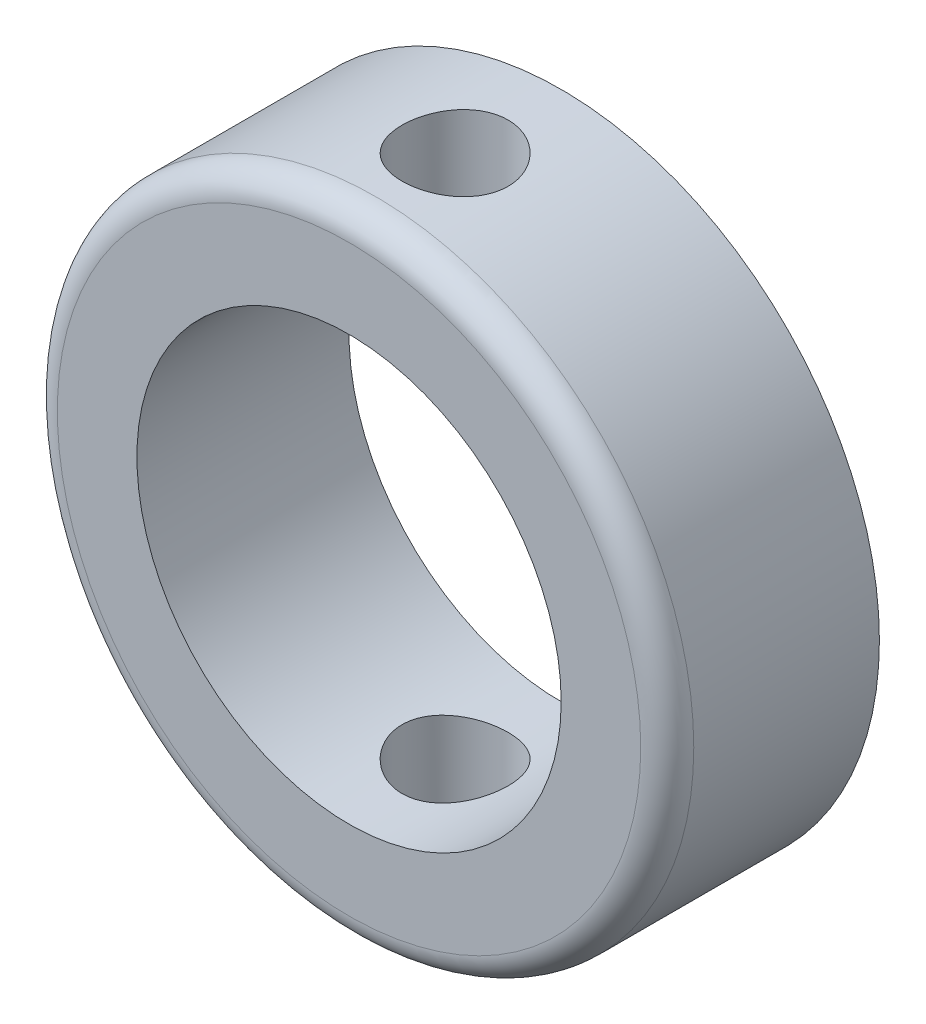
ISO-10303-21;
HEADER;
FILE_DESCRIPTION(('STEP AP214'),'2;1');
FILE_NAME('part.step','',(''),(''),'','','');
FILE_SCHEMA(('AUTOMOTIVE_DESIGN { 1 0 10303 214 1 1 1 1 }'));
ENDSEC;
DATA;
#1=APPLICATION_CONTEXT('core data for automotive mechanical design processes');
#2=APPLICATION_PROTOCOL_DEFINITION('international standard','automotive_design',2000,#1);
#3=PRODUCT_CONTEXT('',#1,'mechanical');
#4=PRODUCT('Part','Part','',(#3));
#5=PRODUCT_RELATED_PRODUCT_CATEGORY('part','',(#4));
#6=PRODUCT_DEFINITION_FORMATION('','',#4);
#7=PRODUCT_DEFINITION_CONTEXT('part definition',#1,'design');
#8=PRODUCT_DEFINITION('design','',#6,#7);
#9=PRODUCT_DEFINITION_SHAPE('','',#8);
#10=(LENGTH_UNIT() NAMED_UNIT(*) SI_UNIT(.MILLI.,.METRE.));
#11=(NAMED_UNIT(*) PLANE_ANGLE_UNIT() SI_UNIT($,.RADIAN.));
#12=(NAMED_UNIT(*) SI_UNIT($,.STERADIAN.) SOLID_ANGLE_UNIT());
#13=UNCERTAINTY_MEASURE_WITH_UNIT(LENGTH_MEASURE(1.E-05),#10,'distance_accuracy_value','');
#14=(GEOMETRIC_REPRESENTATION_CONTEXT(3) GLOBAL_UNCERTAINTY_ASSIGNED_CONTEXT((#13)) GLOBAL_UNIT_ASSIGNED_CONTEXT((#10,
#11,#12)) REPRESENTATION_CONTEXT('',''));
#15=CARTESIAN_POINT('',(0.,0.,0.));
#16=DIRECTION('',(0.,0.,1.));
#17=DIRECTION('',(1.,0.,0.));
#18=AXIS2_PLACEMENT_3D('',#15,#16,#17);
#19=CARTESIAN_POINT('',(0.,0.,4.));
#20=DIRECTION('',(0.,0.,1.));
#21=DIRECTION('',(1.,0.,0.));
#22=AXIS2_PLACEMENT_3D('',#19,#20,#21);
#23=PLANE('',#22);
#24=CARTESIAN_POINT('',(0.,0.,4.));
#25=DIRECTION('',(0.,0.,1.));
#26=DIRECTION('',(1.,0.,0.));
#27=AXIS2_PLACEMENT_3D('',#24,#25,#26);
#28=CIRCLE('',#27,11.);
#29=CARTESIAN_POINT('',(11.,0.,4.));
#30=VERTEX_POINT('',#29);
#31=EDGE_CURVE('E51',#30,#30,#28,.T.);
#32=ORIENTED_EDGE('',*,*,#31,.T.);
#33=EDGE_LOOP('',(#32));
#34=FACE_BOUND('',#33,.T.);
#35=CARTESIAN_POINT('',(0.,0.,4.));
#36=DIRECTION('',(0.,0.,1.));
#37=DIRECTION('',(1.,0.,0.));
#38=AXIS2_PLACEMENT_3D('',#35,#36,#37);
#39=CIRCLE('',#38,8.);
#40=CARTESIAN_POINT('',(8.,0.,4.));
#41=VERTEX_POINT('',#40);
#42=EDGE_CURVE('E107',#41,#41,#39,.T.);
#43=ORIENTED_EDGE('',*,*,#42,.F.);
#44=EDGE_LOOP('',(#43));
#45=FACE_BOUND('',#44,.T.);
#46=ADVANCED_FACE('F37',(#34,#45),#23,.T.);
#47=CARTESIAN_POINT('',(0.,0.,-4.));
#48=DIRECTION('',(0.,0.,1.));
#49=DIRECTION('',(1.,0.,0.));
#50=AXIS2_PLACEMENT_3D('',#47,#48,#49);
#51=PLANE('',#50);
#52=CARTESIAN_POINT('',(0.,0.,-4.));
#53=DIRECTION('',(0.,0.,1.));
#54=DIRECTION('',(1.,0.,0.));
#55=AXIS2_PLACEMENT_3D('',#52,#53,#54);
#56=CIRCLE('',#55,12.);
#57=CARTESIAN_POINT('',(12.,0.,-4.));
#58=VERTEX_POINT('',#57);
#59=EDGE_CURVE('E57',#58,#58,#56,.T.);
#60=ORIENTED_EDGE('',*,*,#59,.F.);
#61=EDGE_LOOP('',(#60));
#62=FACE_BOUND('',#61,.T.);
#63=CARTESIAN_POINT('',(0.,0.,-4.));
#64=DIRECTION('',(0.,0.,1.));
#65=DIRECTION('',(1.,0.,0.));
#66=AXIS2_PLACEMENT_3D('',#63,#64,#65);
#67=CIRCLE('',#66,8.);
#68=CARTESIAN_POINT('',(8.,0.,-4.));
#69=VERTEX_POINT('',#68);
#70=EDGE_CURVE('E110',#69,#69,#67,.T.);
#71=ORIENTED_EDGE('',*,*,#70,.T.);
#72=EDGE_LOOP('',(#71));
#73=FACE_BOUND('',#72,.T.);
#74=ADVANCED_FACE('F94',(#62,#73),#51,.F.);
#75=CARTESIAN_POINT('',(0.,0.,4.));
#76=DIRECTION('',(0.,0.,-1.));
#77=DIRECTION('',(-1.,0.,0.));
#78=AXIS2_PLACEMENT_3D('',#75,#76,#77);
#79=CYLINDRICAL_SURFACE('',#78,12.);
#80=CARTESIAN_POINT('',(0.,-12.,2.));
#81=CARTESIAN_POINT('',(0.111512723966572,-11.9999980893506,1.99999552884175));
#82=CARTESIAN_POINT('',(0.223086305471057,-11.9984294233043,1.99064218002486));
#83=CARTESIAN_POINT('',(0.443104177338434,-11.9923227595311,1.95349147298774));
#84=CARTESIAN_POINT('',(0.551545494367398,-11.9877820313911,1.92567715447072));
#85=CARTESIAN_POINT('',(0.762083797770115,-11.9762405458916,1.8524676411258));
#86=CARTESIAN_POINT('',(0.86418589474552,-11.9692418012735,1.80708682748754));
#87=CARTESIAN_POINT('',(1.05931347358236,-11.9535538166566,1.70007016635808));
#88=CARTESIAN_POINT('',(1.15233999190287,-11.9448647700355,1.6384361780136));
#89=CARTESIAN_POINT('',(1.32757809143334,-11.9266665396665,1.50003593294363));
#90=CARTESIAN_POINT('',(1.40969032282797,-11.9171509745189,1.4231447082911));
#91=CARTESIAN_POINT('',(1.55991079892794,-11.8984210150139,1.25668162522175));
#92=CARTESIAN_POINT('',(1.62801815951278,-11.8892066397013,1.16710896683471));
#93=CARTESIAN_POINT('',(1.74869370048411,-11.8720605260782,0.977143227042356));
#94=CARTESIAN_POINT('',(1.8011636422888,-11.8641370327331,0.876686930556196));
#95=CARTESIAN_POINT('',(1.88844669232898,-11.8505583183574,0.668232348559499));
#96=CARTESIAN_POINT('',(1.92326099325249,-11.8449029441145,0.560234573057895));
#97=CARTESIAN_POINT('',(1.97393150222785,-11.836564294742,0.340815780114768));
#98=CARTESIAN_POINT('',(1.98995922330832,-11.8338541478856,0.229435410798886));
#99=CARTESIAN_POINT('',(2.0031333802319,-11.8316315114932,0.00553577849322258));
#100=CARTESIAN_POINT('',(2.0002811523112,-11.8321187956577,-0.10698340333384));
#101=CARTESIAN_POINT('',(1.97591607871692,-11.8362114309084,-0.328742289020359));
#102=CARTESIAN_POINT('',(1.95459590551182,-11.8397845865513,-0.438003842836187));
#103=CARTESIAN_POINT('',(1.89420251232276,-11.8495959616881,-0.651377054263307));
#104=CARTESIAN_POINT('',(1.85512868345579,-11.8558342725862,-0.755488535110837));
#105=CARTESIAN_POINT('',(1.76014179687513,-11.8703078346728,-0.956183058752735));
#106=CARTESIAN_POINT('',(1.70414873110377,-11.8785525368586,-1.05272752486498));
#107=CARTESIAN_POINT('',(1.57696961404595,-11.8961033473201,-1.23512352043071));
#108=CARTESIAN_POINT('',(1.50578233652343,-11.9054095412343,-1.32097418596395));
#109=CARTESIAN_POINT('',(1.34918576972724,-11.9241762230383,-1.48066086864588));
#110=CARTESIAN_POINT('',(1.2636111710985,-11.9336371938532,-1.55433481483207));
#111=CARTESIAN_POINT('',(1.08122819918532,-11.9515408111738,-1.68630221013227));
#112=CARTESIAN_POINT('',(0.984419753525138,-11.959983451118,-1.74459556014658));
#113=CARTESIAN_POINT('',(0.782164732933369,-11.9749111431433,-1.84416178170903));
#114=CARTESIAN_POINT('',(0.676710980451729,-11.9813945472596,-1.88542033546501));
#115=CARTESIAN_POINT('',(0.460238676482185,-11.9916600241013,-1.94959537219678));
#116=CARTESIAN_POINT('',(0.349220591343575,-11.9954423228038,-1.97251338957897));
#117=CARTESIAN_POINT('',(0.126167921041299,-11.9998490387415,-1.99913708676891));
#118=CARTESIAN_POINT('',(0.0141605897208092,-12.0005100241023,-2.00306525744449));
#119=CARTESIAN_POINT('',(-0.20891181831191,-11.9986997953694,-1.9921909244575));
#120=CARTESIAN_POINT('',(-0.319976931113631,-11.9962287017929,-1.97738914149301));
#121=CARTESIAN_POINT('',(-0.53732494043741,-11.9884546155056,-1.92966012053162));
#122=CARTESIAN_POINT('',(-0.643632694708303,-11.9831688384105,-1.8968430332879));
#123=CARTESIAN_POINT('',(-0.849237507888353,-11.9703557156429,-1.81413238544037));
#124=CARTESIAN_POINT('',(-0.948534172727775,-11.9628282440962,-1.76423786589178));
#125=CARTESIAN_POINT('',(-1.13826455157517,-11.9462761304193,-1.64827910024257));
#126=CARTESIAN_POINT('',(-1.22861220074972,-11.9372388470962,-1.5820758750662));
#127=CARTESIAN_POINT('',(-1.39699486840215,-11.9187077391352,-1.43557014769195));
#128=CARTESIAN_POINT('',(-1.47502899175727,-11.9092138813724,-1.35526662137867));
#129=CARTESIAN_POINT('',(-1.6173942237264,-11.8907214018868,-1.18184196154286));
#130=CARTESIAN_POINT('',(-1.68157500889097,-11.8817289290968,-1.08859666758847));
#131=CARTESIAN_POINT('',(-1.79336184823599,-11.8653722382231,-0.892517624689169));
#132=CARTESIAN_POINT('',(-1.84096842781586,-11.8580079685282,-0.789684179818004));
#133=CARTESIAN_POINT('',(-1.91803066517852,-11.8457876295816,-0.577768213750295));
#134=CARTESIAN_POINT('',(-1.94756114603836,-11.8409212344885,-0.46871352397561));
#135=CARTESIAN_POINT('',(-1.98786836302262,-11.8342217346821,-0.247103896622592));
#136=CARTESIAN_POINT('',(-1.99864672955693,-11.8323883662618,-0.134549264214359));
#137=CARTESIAN_POINT('',(-2.00109829283788,-11.8319738646721,0.0893641327699263));
#138=CARTESIAN_POINT('',(-1.99300810890015,-11.8333524520452,0.20072030286023));
#139=CARTESIAN_POINT('',(-1.95846387116548,-11.8391182516298,0.420463398440611));
#140=CARTESIAN_POINT('',(-1.93200987688998,-11.8435054540897,0.528850333553496));
#141=CARTESIAN_POINT('',(-1.86157959167592,-11.8547788502538,0.73948674983409));
#142=CARTESIAN_POINT('',(-1.81762367248035,-11.8616621377574,0.841743208044819));
#143=CARTESIAN_POINT('',(-1.71346160313273,-11.8771549513777,1.03746853535588));
#144=CARTESIAN_POINT('',(-1.65325464699885,-11.8857645631072,1.13093696829771));
#145=CARTESIAN_POINT('',(-1.51745510749772,-11.903867632365,1.3076284664862));
#146=CARTESIAN_POINT('',(-1.44168845087492,-11.9133703646104,1.39071681336022));
#147=CARTESIAN_POINT('',(-1.27728722510418,-11.9321149788867,1.54308128357995));
#148=CARTESIAN_POINT('',(-1.18864969033011,-11.9413568002124,1.61235421491054));
#149=CARTESIAN_POINT('',(-1.00029533571223,-11.9586122371378,1.73555861455996));
#150=CARTESIAN_POINT('',(-0.900506230026255,-11.9666169300248,1.78938083145036));
#151=CARTESIAN_POINT('',(-0.693210455503185,-11.9804093408142,1.87941558768794));
#152=CARTESIAN_POINT('',(-0.585711595864008,-11.9861992654199,1.91564566486376));
#153=CARTESIAN_POINT('',(-0.398162648036321,-11.9936463266636,1.96160421930133));
#154=CARTESIAN_POINT('',(-0.319247064238758,-11.9960162181869,1.97597957569277));
#155=CARTESIAN_POINT('',(-0.160231448255847,-11.999193727889,1.9951789902758));
#156=CARTESIAN_POINT('',(-0.0801314364867954,-12.0000013729651,2.00000321290989));
#157=CARTESIAN_POINT('',(0.,-12.,2.));
#158=B_SPLINE_CURVE_WITH_KNOTS('',3,(#80,#81,#82,#83,#84,#85,#86,#87,#88,#89,#90,#91,#92,#93,
#94,#95,#96,#97,#98,#99,#100,#101,#102,#103,#104,#105,#106,#107,#108,#109,#110,#111,#112,#113,
#114,#115,#116,#117,#118,#119,#120,#121,#122,#123,#124,#125,#126,#127,#128,#129,#130,#131,#132,
#133,#134,#135,#136,#137,#138,#139,#140,#141,#142,#143,#144,#145,#146,#147,#148,#149,#150,#151,
#152,#153,#154,#155,#156,#157),.UNSPECIFIED.,.T.,.F.,(4,2,2,2,2,2,2,2,2,2,2,2,2,2,2,2,2,2,2,2,2,
2,2,2,2,2,2,2,2,2,2,2,2,2,2,2,2,2,4),(0.,0.334245267950808,0.668798036556336,1.00307749362022,
1.33731873013983,1.67441992849866,2.01154240135885,2.35074016659072,2.68991501500945,
3.02596861682739,3.36199843456709,3.69456417408327,4.02714132020305,4.36131645306046,
4.69551856544459,5.03386215929061,5.37220793308678,5.71083751132723,6.04943875616919,
6.38406306793118,6.71867450428688,7.05126245605132,7.38386908660853,7.71941460501619,
8.05498450443426,8.39403057606095,8.73306589900754,9.07068817873417,9.40828110229294,
9.7416632761816,10.0750443695051,10.4080385458098,10.7410492402347,11.0780110735471,
11.4150506710318,11.7544178528576,12.0934460170406,12.3336339853121,12.5738178182157),.UNSPECIFIED.);
#159=CARTESIAN_POINT('',(0.,-12.,2.));
#160=VERTEX_POINT('',#159);
#161=EDGE_CURVE('E85',#160,#160,#158,.T.);
#162=ORIENTED_EDGE('',*,*,#161,.T.);
#163=EDGE_LOOP('',(#162));
#164=FACE_BOUND('',#163,.T.);
#165=CARTESIAN_POINT('',(0.,12.,2.));
#166=CARTESIAN_POINT('',(-0.111512723966572,11.9999980893506,1.99999552884175));
#167=CARTESIAN_POINT('',(-0.223086305471057,11.9984294233043,1.99064218002486));
#168=CARTESIAN_POINT('',(-0.443104177338434,11.9923227595311,1.95349147298774));
#169=CARTESIAN_POINT('',(-0.551545494367398,11.9877820313911,1.92567715447072));
#170=CARTESIAN_POINT('',(-0.762083797770115,11.9762405458916,1.8524676411258));
#171=CARTESIAN_POINT('',(-0.86418589474552,11.9692418012735,1.80708682748754));
#172=CARTESIAN_POINT('',(-1.05931347358236,11.9535538166566,1.70007016635808));
#173=CARTESIAN_POINT('',(-1.15233999190287,11.9448647700355,1.6384361780136));
#174=CARTESIAN_POINT('',(-1.32757809143334,11.9266665396665,1.50003593294363));
#175=CARTESIAN_POINT('',(-1.40969032282797,11.9171509745189,1.4231447082911));
#176=CARTESIAN_POINT('',(-1.55991079892794,11.8984210150139,1.25668162522175));
#177=CARTESIAN_POINT('',(-1.62801815951278,11.8892066397013,1.16710896683471));
#178=CARTESIAN_POINT('',(-1.74869370048411,11.8720605260782,0.977143227042356));
#179=CARTESIAN_POINT('',(-1.8011636422888,11.8641370327331,0.876686930556196));
#180=CARTESIAN_POINT('',(-1.88844669232898,11.8505583183574,0.668232348559499));
#181=CARTESIAN_POINT('',(-1.92326099325249,11.8449029441145,0.560234573057895));
#182=CARTESIAN_POINT('',(-1.97393150222785,11.836564294742,0.340815780114768));
#183=CARTESIAN_POINT('',(-1.98995922330832,11.8338541478856,0.229435410798886));
#184=CARTESIAN_POINT('',(-2.0031333802319,11.8316315114932,0.00553577849322258));
#185=CARTESIAN_POINT('',(-2.0002811523112,11.8321187956577,-0.10698340333384));
#186=CARTESIAN_POINT('',(-1.97591607871692,11.8362114309084,-0.328742289020359));
#187=CARTESIAN_POINT('',(-1.95459590551182,11.8397845865513,-0.438003842836187));
#188=CARTESIAN_POINT('',(-1.89420251232276,11.8495959616881,-0.651377054263307));
#189=CARTESIAN_POINT('',(-1.85512868345579,11.8558342725862,-0.755488535110837));
#190=CARTESIAN_POINT('',(-1.76014179687513,11.8703078346728,-0.956183058752735));
#191=CARTESIAN_POINT('',(-1.70414873110377,11.8785525368586,-1.05272752486498));
#192=CARTESIAN_POINT('',(-1.57696961404595,11.8961033473201,-1.23512352043071));
#193=CARTESIAN_POINT('',(-1.50578233652343,11.9054095412343,-1.32097418596395));
#194=CARTESIAN_POINT('',(-1.34918576972724,11.9241762230383,-1.48066086864588));
#195=CARTESIAN_POINT('',(-1.2636111710985,11.9336371938532,-1.55433481483207));
#196=CARTESIAN_POINT('',(-1.08122819918532,11.9515408111738,-1.68630221013227));
#197=CARTESIAN_POINT('',(-0.984419753525138,11.959983451118,-1.74459556014658));
#198=CARTESIAN_POINT('',(-0.782164732933369,11.9749111431433,-1.84416178170903));
#199=CARTESIAN_POINT('',(-0.676710980451729,11.9813945472596,-1.88542033546501));
#200=CARTESIAN_POINT('',(-0.460238676482185,11.9916600241013,-1.94959537219678));
#201=CARTESIAN_POINT('',(-0.349220591343575,11.9954423228038,-1.97251338957897));
#202=CARTESIAN_POINT('',(-0.126167921041299,11.9998490387415,-1.99913708676891));
#203=CARTESIAN_POINT('',(-0.0141605897208092,12.0005100241023,-2.00306525744449));
#204=CARTESIAN_POINT('',(0.20891181831191,11.9986997953694,-1.9921909244575));
#205=CARTESIAN_POINT('',(0.319976931113631,11.9962287017929,-1.97738914149301));
#206=CARTESIAN_POINT('',(0.53732494043741,11.9884546155056,-1.92966012053162));
#207=CARTESIAN_POINT('',(0.643632694708303,11.9831688384105,-1.8968430332879));
#208=CARTESIAN_POINT('',(0.849237507888353,11.9703557156429,-1.81413238544037));
#209=CARTESIAN_POINT('',(0.948534172727775,11.9628282440962,-1.76423786589178));
#210=CARTESIAN_POINT('',(1.13826455157517,11.9462761304193,-1.64827910024257));
#211=CARTESIAN_POINT('',(1.22861220074972,11.9372388470962,-1.5820758750662));
#212=CARTESIAN_POINT('',(1.39699486840215,11.9187077391352,-1.43557014769195));
#213=CARTESIAN_POINT('',(1.47502899175727,11.9092138813724,-1.35526662137867));
#214=CARTESIAN_POINT('',(1.6173942237264,11.8907214018868,-1.18184196154286));
#215=CARTESIAN_POINT('',(1.68157500889097,11.8817289290968,-1.08859666758847));
#216=CARTESIAN_POINT('',(1.79336184823599,11.8653722382231,-0.892517624689169));
#217=CARTESIAN_POINT('',(1.84096842781586,11.8580079685282,-0.789684179818004));
#218=CARTESIAN_POINT('',(1.91803066517852,11.8457876295816,-0.577768213750295));
#219=CARTESIAN_POINT('',(1.94756114603836,11.8409212344885,-0.46871352397561));
#220=CARTESIAN_POINT('',(1.98786836302262,11.8342217346821,-0.247103896622592));
#221=CARTESIAN_POINT('',(1.99864672955693,11.8323883662618,-0.134549264214359));
#222=CARTESIAN_POINT('',(2.00109829283788,11.8319738646721,0.0893641327699263));
#223=CARTESIAN_POINT('',(1.99300810890015,11.8333524520452,0.20072030286023));
#224=CARTESIAN_POINT('',(1.95846387116548,11.8391182516298,0.420463398440611));
#225=CARTESIAN_POINT('',(1.93200987688998,11.8435054540897,0.528850333553496));
#226=CARTESIAN_POINT('',(1.86157959167592,11.8547788502538,0.73948674983409));
#227=CARTESIAN_POINT('',(1.81762367248035,11.8616621377574,0.841743208044819));
#228=CARTESIAN_POINT('',(1.71346160313273,11.8771549513777,1.03746853535588));
#229=CARTESIAN_POINT('',(1.65325464699885,11.8857645631072,1.13093696829771));
#230=CARTESIAN_POINT('',(1.51745510749772,11.903867632365,1.3076284664862));
#231=CARTESIAN_POINT('',(1.44168845087492,11.9133703646104,1.39071681336022));
#232=CARTESIAN_POINT('',(1.27728722510418,11.9321149788867,1.54308128357995));
#233=CARTESIAN_POINT('',(1.18864969033011,11.9413568002124,1.61235421491054));
#234=CARTESIAN_POINT('',(1.00029533571223,11.9586122371378,1.73555861455996));
#235=CARTESIAN_POINT('',(0.900506230026255,11.9666169300248,1.78938083145036));
#236=CARTESIAN_POINT('',(0.693210455503185,11.9804093408142,1.87941558768794));
#237=CARTESIAN_POINT('',(0.585711595864008,11.9861992654199,1.91564566486376));
#238=CARTESIAN_POINT('',(0.398162648036321,11.9936463266636,1.96160421930133));
#239=CARTESIAN_POINT('',(0.319247064238758,11.9960162181869,1.97597957569277));
#240=CARTESIAN_POINT('',(0.160231448255847,11.999193727889,1.9951789902758));
#241=CARTESIAN_POINT('',(0.0801314364867954,12.0000013729651,2.00000321290989));
#242=CARTESIAN_POINT('',(0.,12.,2.));
#243=B_SPLINE_CURVE_WITH_KNOTS('',3,(#165,#166,#167,#168,#169,#170,#171,#172,#173,#174,#175,
#176,#177,#178,#179,#180,#181,#182,#183,#184,#185,#186,#187,#188,#189,#190,#191,#192,#193,#194,
#195,#196,#197,#198,#199,#200,#201,#202,#203,#204,#205,#206,#207,#208,#209,#210,#211,#212,#213,
#214,#215,#216,#217,#218,#219,#220,#221,#222,#223,#224,#225,#226,#227,#228,#229,#230,#231,#232,
#233,#234,#235,#236,#237,#238,#239,#240,#241,#242),.UNSPECIFIED.,.T.,.F.,(4,2,2,2,2,2,2,2,2,2,2,
2,2,2,2,2,2,2,2,2,2,2,2,2,2,2,2,2,2,2,2,2,2,2,2,2,2,2,4),(0.,0.334245267950808,
0.668798036556336,1.00307749362022,1.33731873013983,1.67441992849866,2.01154240135885,
2.35074016659072,2.68991501500945,3.02596861682739,3.36199843456709,3.69456417408327,
4.02714132020305,4.36131645306046,4.69551856544459,5.03386215929061,5.37220793308678,
5.71083751132723,6.04943875616919,6.38406306793118,6.71867450428688,7.05126245605132,
7.38386908660853,7.71941460501619,8.05498450443426,8.39403057606095,8.73306589900754,
9.07068817873417,9.40828110229294,9.7416632761816,10.0750443695051,10.4080385458098,
10.7410492402347,11.0780110735471,11.4150506710318,11.7544178528576,12.0934460170406,
12.3336339853121,12.5738178182157),.UNSPECIFIED.);
#244=CARTESIAN_POINT('',(0.,12.,2.));
#245=VERTEX_POINT('',#244);
#246=EDGE_CURVE('E79',#245,#245,#243,.T.);
#247=ORIENTED_EDGE('',*,*,#246,.T.);
#248=EDGE_LOOP('',(#247));
#249=FACE_BOUND('',#248,.T.);
#250=CARTESIAN_POINT('',(0.,0.,3.));
#251=DIRECTION('',(0.,0.,1.));
#252=DIRECTION('',(1.,0.,0.));
#253=AXIS2_PLACEMENT_3D('',#250,#251,#252);
#254=CIRCLE('',#253,12.);
#255=CARTESIAN_POINT('',(12.,0.,3.));
#256=VERTEX_POINT('',#255);
#257=EDGE_CURVE('E10',#256,#256,#254,.F.);
#258=ORIENTED_EDGE('',*,*,#257,.T.);
#259=EDGE_LOOP('',(#258));
#260=FACE_BOUND('',#259,.T.);
#261=ORIENTED_EDGE('',*,*,#59,.T.);
#262=EDGE_LOOP('',(#261));
#263=FACE_BOUND('',#262,.T.);
#264=ADVANCED_FACE('F90',(#164,#249,#260,#263),#79,.T.);
#265=CARTESIAN_POINT('',(0.,0.,4.));
#266=DIRECTION('',(0.,0.,-1.));
#267=DIRECTION('',(-1.,0.,0.));
#268=AXIS2_PLACEMENT_3D('',#265,#266,#267);
#269=CYLINDRICAL_SURFACE('',#268,8.);
#270=CARTESIAN_POINT('',(0.,-8.,2.));
#271=CARTESIAN_POINT('',(0.110501451559641,-7.99999813157349,1.99999689901579));
#272=CARTESIAN_POINT('',(0.221037543774351,-7.99768770842435,1.99081126563495));
#273=CARTESIAN_POINT('',(0.438941765027377,-7.98869485106526,1.95436646492399));
#274=CARTESIAN_POINT('',(0.546308062494319,-7.98200993893301,1.92709705394953));
#275=CARTESIAN_POINT('',(0.754694496243435,-7.96500835109376,1.85541432871722));
#276=CARTESIAN_POINT('',(0.855722084573336,-7.95469603789411,1.81102160171297));
#277=CARTESIAN_POINT('',(1.04889617587257,-7.93153791743495,1.70642481327354));
#278=CARTESIAN_POINT('',(1.14104237913168,-7.91869202472208,1.64622021850804));
#279=CARTESIAN_POINT('',(1.31573590306789,-7.89156551455591,1.51039894712776));
#280=CARTESIAN_POINT('',(1.39807425341474,-7.87726276197501,1.43451790005459));
#281=CARTESIAN_POINT('',(1.54899856960443,-7.84898160157248,1.27006372678795));
#282=CARTESIAN_POINT('',(1.61758298259892,-7.83500323053157,1.18148916940409));
#283=CARTESIAN_POINT('',(1.74003539039863,-7.80873034264224,0.992539697684013));
#284=CARTESIAN_POINT('',(1.79366962123352,-7.79646392619748,0.892009025588362));
#285=CARTESIAN_POINT('',(1.88319587806766,-7.77532659757355,0.68300211778662));
#286=CARTESIAN_POINT('',(1.91909074058685,-7.76645514259224,0.574527155557313));
#287=CARTESIAN_POINT('',(1.97140644907302,-7.7533396892843,0.355008669064455));
#288=CARTESIAN_POINT('',(1.98820302444274,-7.74900654662681,0.244060138616011));
#289=CARTESIAN_POINT('',(2.00301570008854,-7.74519149946122,0.0208419080008735));
#290=CARTESIAN_POINT('',(2.00103485575748,-7.74570880570571,-0.0914275742561822));
#291=CARTESIAN_POINT('',(1.97864869951961,-7.75145607355756,-0.311221076993804));
#292=CARTESIAN_POINT('',(1.95869112025418,-7.75657150676391,-0.418794161953773));
#293=CARTESIAN_POINT('',(1.90163224920399,-7.77075612894758,-0.629014734548078));
#294=CARTESIAN_POINT('',(1.86452973609252,-7.77982559958985,-0.731661870705228));
#295=CARTESIAN_POINT('',(1.77385263724958,-7.80100151874212,-0.930317355002839));
#296=CARTESIAN_POINT('',(1.72011555631056,-7.81313769959755,-1.02624822905276));
#297=CARTESIAN_POINT('',(1.59780836801993,-7.83906281127988,-1.20789161300909));
#298=CARTESIAN_POINT('',(1.52923566507845,-7.85285203112837,-1.29360233075633));
#299=CARTESIAN_POINT('',(1.37688456624163,-7.88101174053188,-1.45493815425921));
#300=CARTESIAN_POINT('',(1.29272834422115,-7.89538759304001,-1.53020598674847));
#301=CARTESIAN_POINT('',(1.11281589000493,-7.92274620771675,-1.6656283232852));
#302=CARTESIAN_POINT('',(1.01705930361059,-7.93572892732543,-1.72578236568475));
#303=CARTESIAN_POINT('',(0.816154518241856,-7.9589030945892,-1.82940078163251));
#304=CARTESIAN_POINT('',(0.710975190944831,-7.96908480170303,-1.87280712033924));
#305=CARTESIAN_POINT('',(0.49450134419051,-7.98543889321888,-1.94122307427943));
#306=CARTESIAN_POINT('',(0.383207998867313,-7.99161204452373,-1.96623620855752));
#307=CARTESIAN_POINT('',(0.160719960520036,-7.999139990285,-1.99661008741178));
#308=CARTESIAN_POINT('',(0.0495956266509465,-8.00061404677705,-2.0024573681004));
#309=CARTESIAN_POINT('',(-0.172043833068677,-7.99891739752601,-1.99566799725935));
#310=CARTESIAN_POINT('',(-0.28255901285946,-7.99574710989128,-1.98303300960116));
#311=CARTESIAN_POINT('',(-0.498152358368656,-7.98519441503143,-1.94003878881149));
#312=CARTESIAN_POINT('',(-0.603286825291673,-7.97787512247748,-1.90994498203068));
#313=CARTESIAN_POINT('',(-0.807009723270015,-7.95984942178845,-1.83319055462874));
#314=CARTESIAN_POINT('',(-0.905597492043513,-7.94914267159856,-1.78652826091577));
#315=CARTESIAN_POINT('',(-1.0953641792398,-7.92524410568414,-1.6770184948337));
#316=CARTESIAN_POINT('',(-1.18638058911444,-7.91201156489243,-1.61389851680432));
#317=CARTESIAN_POINT('',(-1.35670215152433,-7.88459345583226,-1.47361345493737));
#318=CARTESIAN_POINT('',(-1.43600527863068,-7.87040772335606,-1.39644594717746));
#319=CARTESIAN_POINT('',(-1.58265409076364,-7.84225275947695,-1.22799738554071));
#320=CARTESIAN_POINT('',(-1.64965849016271,-7.82829738916374,-1.13641639599677));
#321=CARTESIAN_POINT('',(-1.7673476786836,-7.80257171169651,-0.94302315404571));
#322=CARTESIAN_POINT('',(-1.81803319221058,-7.79080130756035,-0.841211356053663));
#323=CARTESIAN_POINT('',(-1.90126856081239,-7.77090792979553,-0.630792370115896));
#324=CARTESIAN_POINT('',(-1.93392586220542,-7.76276340389207,-0.522229828874655));
#325=CARTESIAN_POINT('',(-1.98046087993837,-7.75102325453578,-0.300920482814523));
#326=CARTESIAN_POINT('',(-1.99434270330488,-7.74742663626581,-0.188174598623347));
#327=CARTESIAN_POINT('',(-2.00271812044533,-7.74526534938609,0.0348280318069358));
#328=CARTESIAN_POINT('',(-1.99775719704016,-7.74655910304351,0.145063246832973));
#329=CARTESIAN_POINT('',(-1.96983637108382,-7.7537054534379,0.363071851557307));
#330=CARTESIAN_POINT('',(-1.94687683024903,-7.75955795855809,0.470845290684866));
#331=CARTESIAN_POINT('',(-1.88390842592373,-7.77508347576963,0.680277945420543));
#332=CARTESIAN_POINT('',(-1.84400187290717,-7.78473353648412,0.781969740320276));
#333=CARTESIAN_POINT('',(-1.74835321814009,-7.80677007633105,0.977287176951585));
#334=CARTESIAN_POINT('',(-1.69260892004558,-7.81915693494364,1.07091169758255));
#335=CARTESIAN_POINT('',(-1.56515699818285,-7.84567512351349,1.25007283866936));
#336=CARTESIAN_POINT('',(-1.49307088388301,-7.85984353109009,1.33533476456528));
#337=CARTESIAN_POINT('',(-1.33571916158631,-7.88810702995047,1.49272939306054));
#338=CARTESIAN_POINT('',(-1.25045042834819,-7.90220210302746,1.56485897348396));
#339=CARTESIAN_POINT('',(-1.06729011560345,-7.92903540863551,1.69521507808614));
#340=CARTESIAN_POINT('',(-0.969197896421849,-7.94174444487824,1.75316615156211));
#341=CARTESIAN_POINT('',(-0.764354746013968,-7.96406566633491,1.85166328392071));
#342=CARTESIAN_POINT('',(-0.657610084582319,-7.97368006933042,1.89222181419805));
#343=CARTESIAN_POINT('',(-0.459213670991295,-7.98730746087388,1.94876244043954));
#344=CARTESIAN_POINT('',(-0.368506894544091,-7.9920344673692,1.96793499073791));
#345=CARTESIAN_POINT('',(-0.18520809538171,-7.99838140309264,1.99355459149592));
#346=CARTESIAN_POINT('',(-0.0926162149901548,-8.00000156601192,2.00000259907373));
#347=CARTESIAN_POINT('',(0.,-8.,2.));
#348=B_SPLINE_CURVE_WITH_KNOTS('',3,(#270,#271,#272,#273,#274,#275,#276,#277,#278,#279,#280,
#281,#282,#283,#284,#285,#286,#287,#288,#289,#290,#291,#292,#293,#294,#295,#296,#297,#298,#299,
#300,#301,#302,#303,#304,#305,#306,#307,#308,#309,#310,#311,#312,#313,#314,#315,#316,#317,#318,
#319,#320,#321,#322,#323,#324,#325,#326,#327,#328,#329,#330,#331,#332,#333,#334,#335,#336,#337,
#338,#339,#340,#341,#342,#343,#344,#345,#346,#347),.UNSPECIFIED.,.T.,.F.,(4,2,2,2,2,2,2,2,2,2,2,
2,2,2,2,2,2,2,2,2,2,2,2,2,2,2,2,2,2,2,2,2,2,2,2,2,2,2,4),(0.,0.331164949962519,
0.662517650351866,0.993473203048141,1.32443992022577,1.66152580582852,1.99864972773416,
2.34078196727742,2.68285948225824,3.01808393468093,3.3532538415469,3.68029996013785,
4.00736937959146,4.337740371696,4.66816921119311,5.00802001296453,5.34788119415424,
5.6889097201658,6.02987298255951,6.36211078603463,6.69431868154751,7.02160366023144,
7.34892169767481,7.68204783424897,8.01523150681786,8.35659345610395,8.69794025003772,
9.03723006156476,9.37644564340971,9.70591707202577,10.0353818794581,10.3628853408369,
10.6904342418696,11.0265276855097,11.3627009303165,11.7049624733721,12.0469781843289,
12.3245632392729,12.6021274139515),.UNSPECIFIED.);
#349=CARTESIAN_POINT('',(0.,-8.,2.));
#350=VERTEX_POINT('',#349);
#351=EDGE_CURVE('E41',#350,#350,#348,.T.);
#352=ORIENTED_EDGE('',*,*,#351,.F.);
#353=EDGE_LOOP('',(#352));
#354=FACE_BOUND('',#353,.T.);
#355=CARTESIAN_POINT('',(0.,8.,2.));
#356=CARTESIAN_POINT('',(-0.110501451559641,7.99999813157349,1.99999689901579));
#357=CARTESIAN_POINT('',(-0.221037543774351,7.99768770842435,1.99081126563495));
#358=CARTESIAN_POINT('',(-0.438941765027377,7.98869485106526,1.95436646492399));
#359=CARTESIAN_POINT('',(-0.546308062494319,7.98200993893301,1.92709705394953));
#360=CARTESIAN_POINT('',(-0.754694496243435,7.96500835109376,1.85541432871722));
#361=CARTESIAN_POINT('',(-0.855722084573336,7.95469603789411,1.81102160171297));
#362=CARTESIAN_POINT('',(-1.04889617587257,7.93153791743495,1.70642481327354));
#363=CARTESIAN_POINT('',(-1.14104237913168,7.91869202472208,1.64622021850804));
#364=CARTESIAN_POINT('',(-1.31573590306789,7.89156551455591,1.51039894712776));
#365=CARTESIAN_POINT('',(-1.39807425341474,7.87726276197501,1.43451790005459));
#366=CARTESIAN_POINT('',(-1.54899856960443,7.84898160157248,1.27006372678795));
#367=CARTESIAN_POINT('',(-1.61758298259892,7.83500323053157,1.18148916940409));
#368=CARTESIAN_POINT('',(-1.74003539039863,7.80873034264224,0.992539697684013));
#369=CARTESIAN_POINT('',(-1.79366962123352,7.79646392619748,0.892009025588362));
#370=CARTESIAN_POINT('',(-1.88319587806766,7.77532659757355,0.68300211778662));
#371=CARTESIAN_POINT('',(-1.91909074058685,7.76645514259224,0.574527155557313));
#372=CARTESIAN_POINT('',(-1.97140644907302,7.7533396892843,0.355008669064455));
#373=CARTESIAN_POINT('',(-1.98820302444274,7.74900654662681,0.244060138616011));
#374=CARTESIAN_POINT('',(-2.00301570008854,7.74519149946122,0.0208419080008735));
#375=CARTESIAN_POINT('',(-2.00103485575748,7.74570880570571,-0.0914275742561822));
#376=CARTESIAN_POINT('',(-1.97864869951961,7.75145607355756,-0.311221076993804));
#377=CARTESIAN_POINT('',(-1.95869112025418,7.75657150676391,-0.418794161953773));
#378=CARTESIAN_POINT('',(-1.90163224920399,7.77075612894758,-0.629014734548078));
#379=CARTESIAN_POINT('',(-1.86452973609252,7.77982559958985,-0.731661870705228));
#380=CARTESIAN_POINT('',(-1.77385263724958,7.80100151874212,-0.930317355002839));
#381=CARTESIAN_POINT('',(-1.72011555631056,7.81313769959755,-1.02624822905276));
#382=CARTESIAN_POINT('',(-1.59780836801993,7.83906281127988,-1.20789161300909));
#383=CARTESIAN_POINT('',(-1.52923566507845,7.85285203112837,-1.29360233075633));
#384=CARTESIAN_POINT('',(-1.37688456624163,7.88101174053188,-1.45493815425921));
#385=CARTESIAN_POINT('',(-1.29272834422115,7.89538759304001,-1.53020598674847));
#386=CARTESIAN_POINT('',(-1.11281589000493,7.92274620771675,-1.6656283232852));
#387=CARTESIAN_POINT('',(-1.01705930361059,7.93572892732543,-1.72578236568475));
#388=CARTESIAN_POINT('',(-0.816154518241856,7.9589030945892,-1.82940078163251));
#389=CARTESIAN_POINT('',(-0.710975190944831,7.96908480170303,-1.87280712033924));
#390=CARTESIAN_POINT('',(-0.49450134419051,7.98543889321888,-1.94122307427943));
#391=CARTESIAN_POINT('',(-0.383207998867313,7.99161204452373,-1.96623620855752));
#392=CARTESIAN_POINT('',(-0.160719960520036,7.999139990285,-1.99661008741178));
#393=CARTESIAN_POINT('',(-0.0495956266509465,8.00061404677705,-2.0024573681004));
#394=CARTESIAN_POINT('',(0.172043833068677,7.99891739752601,-1.99566799725935));
#395=CARTESIAN_POINT('',(0.28255901285946,7.99574710989128,-1.98303300960116));
#396=CARTESIAN_POINT('',(0.498152358368656,7.98519441503143,-1.94003878881149));
#397=CARTESIAN_POINT('',(0.603286825291673,7.97787512247748,-1.90994498203068));
#398=CARTESIAN_POINT('',(0.807009723270015,7.95984942178845,-1.83319055462874));
#399=CARTESIAN_POINT('',(0.905597492043513,7.94914267159856,-1.78652826091577));
#400=CARTESIAN_POINT('',(1.0953641792398,7.92524410568414,-1.6770184948337));
#401=CARTESIAN_POINT('',(1.18638058911444,7.91201156489243,-1.61389851680432));
#402=CARTESIAN_POINT('',(1.35670215152433,7.88459345583226,-1.47361345493737));
#403=CARTESIAN_POINT('',(1.43600527863068,7.87040772335606,-1.39644594717746));
#404=CARTESIAN_POINT('',(1.58265409076364,7.84225275947695,-1.22799738554071));
#405=CARTESIAN_POINT('',(1.64965849016271,7.82829738916374,-1.13641639599677));
#406=CARTESIAN_POINT('',(1.7673476786836,7.80257171169651,-0.94302315404571));
#407=CARTESIAN_POINT('',(1.81803319221058,7.79080130756035,-0.841211356053663));
#408=CARTESIAN_POINT('',(1.90126856081239,7.77090792979553,-0.630792370115896));
#409=CARTESIAN_POINT('',(1.93392586220542,7.76276340389207,-0.522229828874655));
#410=CARTESIAN_POINT('',(1.98046087993837,7.75102325453578,-0.300920482814523));
#411=CARTESIAN_POINT('',(1.99434270330488,7.74742663626581,-0.188174598623347));
#412=CARTESIAN_POINT('',(2.00271812044533,7.74526534938609,0.0348280318069358));
#413=CARTESIAN_POINT('',(1.99775719704016,7.74655910304351,0.145063246832973));
#414=CARTESIAN_POINT('',(1.96983637108382,7.7537054534379,0.363071851557307));
#415=CARTESIAN_POINT('',(1.94687683024903,7.75955795855809,0.470845290684866));
#416=CARTESIAN_POINT('',(1.88390842592373,7.77508347576963,0.680277945420543));
#417=CARTESIAN_POINT('',(1.84400187290717,7.78473353648412,0.781969740320276));
#418=CARTESIAN_POINT('',(1.74835321814009,7.80677007633105,0.977287176951585));
#419=CARTESIAN_POINT('',(1.69260892004558,7.81915693494364,1.07091169758255));
#420=CARTESIAN_POINT('',(1.56515699818285,7.84567512351349,1.25007283866936));
#421=CARTESIAN_POINT('',(1.49307088388301,7.85984353109009,1.33533476456528));
#422=CARTESIAN_POINT('',(1.33571916158631,7.88810702995047,1.49272939306054));
#423=CARTESIAN_POINT('',(1.25045042834819,7.90220210302746,1.56485897348396));
#424=CARTESIAN_POINT('',(1.06729011560345,7.92903540863551,1.69521507808614));
#425=CARTESIAN_POINT('',(0.969197896421849,7.94174444487824,1.75316615156211));
#426=CARTESIAN_POINT('',(0.764354746013968,7.96406566633491,1.85166328392071));
#427=CARTESIAN_POINT('',(0.657610084582319,7.97368006933042,1.89222181419805));
#428=CARTESIAN_POINT('',(0.459213670991295,7.98730746087388,1.94876244043954));
#429=CARTESIAN_POINT('',(0.368506894544091,7.9920344673692,1.96793499073791));
#430=CARTESIAN_POINT('',(0.18520809538171,7.99838140309264,1.99355459149592));
#431=CARTESIAN_POINT('',(0.0926162149901548,8.00000156601192,2.00000259907373));
#432=CARTESIAN_POINT('',(0.,8.,2.));
#433=B_SPLINE_CURVE_WITH_KNOTS('',3,(#355,#356,#357,#358,#359,#360,#361,#362,#363,#364,#365,
#366,#367,#368,#369,#370,#371,#372,#373,#374,#375,#376,#377,#378,#379,#380,#381,#382,#383,#384,
#385,#386,#387,#388,#389,#390,#391,#392,#393,#394,#395,#396,#397,#398,#399,#400,#401,#402,#403,
#404,#405,#406,#407,#408,#409,#410,#411,#412,#413,#414,#415,#416,#417,#418,#419,#420,#421,#422,
#423,#424,#425,#426,#427,#428,#429,#430,#431,#432),.UNSPECIFIED.,.T.,.F.,(4,2,2,2,2,2,2,2,2,2,2,
2,2,2,2,2,2,2,2,2,2,2,2,2,2,2,2,2,2,2,2,2,2,2,2,2,2,2,4),(0.,0.331164949962519,
0.662517650351866,0.993473203048141,1.32443992022577,1.66152580582852,1.99864972773416,
2.34078196727742,2.68285948225824,3.01808393468093,3.3532538415469,3.68029996013785,
4.00736937959146,4.337740371696,4.66816921119311,5.00802001296453,5.34788119415424,
5.6889097201658,6.02987298255951,6.36211078603463,6.69431868154751,7.02160366023144,
7.34892169767481,7.68204783424897,8.01523150681786,8.35659345610395,8.69794025003772,
9.03723006156476,9.37644564340971,9.70591707202577,10.0353818794581,10.3628853408369,
10.6904342418696,11.0265276855097,11.3627009303165,11.7049624733721,12.0469781843289,
12.3245632392729,12.6021274139515),.UNSPECIFIED.);
#434=CARTESIAN_POINT('',(0.,8.,2.));
#435=VERTEX_POINT('',#434);
#436=EDGE_CURVE('E60',#435,#435,#433,.T.);
#437=ORIENTED_EDGE('',*,*,#436,.F.);
#438=EDGE_LOOP('',(#437));
#439=FACE_BOUND('',#438,.T.);
#440=ORIENTED_EDGE('',*,*,#42,.T.);
#441=EDGE_LOOP('',(#440));
#442=FACE_BOUND('',#441,.T.);
#443=ORIENTED_EDGE('',*,*,#70,.F.);
#444=EDGE_LOOP('',(#443));
#445=FACE_BOUND('',#444,.T.);
#446=ADVANCED_FACE('F66',(#354,#439,#442,#445),#269,.F.);
#447=CARTESIAN_POINT('',(0.,0.,3.));
#448=DIRECTION('',(0.,0.,1.));
#449=DIRECTION('',(1.,0.,0.));
#450=AXIS2_PLACEMENT_3D('',#447,#448,#449);
#451=TOROIDAL_SURFACE('',#450,11.,1.);
#452=ORIENTED_EDGE('',*,*,#257,.F.);
#453=EDGE_LOOP('',(#452));
#454=FACE_BOUND('',#453,.T.);
#455=ORIENTED_EDGE('',*,*,#31,.F.);
#456=EDGE_LOOP('',(#455));
#457=FACE_BOUND('',#456,.T.);
#458=ADVANCED_FACE('F39',(#454,#457),#451,.T.);
#459=CARTESIAN_POINT('',(0.,-50.,0.));
#460=DIRECTION('',(0.,1.,0.));
#461=DIRECTION('',(0.,0.,1.));
#462=AXIS2_PLACEMENT_3D('',#459,#460,#461);
#463=CYLINDRICAL_SURFACE('',#462,2.);
#464=ORIENTED_EDGE('',*,*,#436,.T.);
#465=EDGE_LOOP('',(#464));
#466=FACE_BOUND('',#465,.T.);
#467=ORIENTED_EDGE('',*,*,#246,.F.);
#468=EDGE_LOOP('',(#467));
#469=FACE_BOUND('',#468,.T.);
#470=ADVANCED_FACE('F72',(#466,#469),#463,.F.);
#471=ORIENTED_EDGE('',*,*,#351,.T.);
#472=EDGE_LOOP('',(#471));
#473=FACE_BOUND('',#472,.T.);
#474=ORIENTED_EDGE('',*,*,#161,.F.);
#475=EDGE_LOOP('',(#474));
#476=FACE_BOUND('',#475,.T.);
#477=ADVANCED_FACE('F69',(#473,#476),#463,.F.);
#478=CLOSED_SHELL('',(#46,#74,#264,#446,#458,#470,#477));
#479=MANIFOLD_SOLID_BREP('B2',#478);
#480=ADVANCED_BREP_SHAPE_REPRESENTATION('',(#18,#479),#14);
#481=SHAPE_DEFINITION_REPRESENTATION(#9,#480);
ENDSEC;
END-ISO-10303-21;
